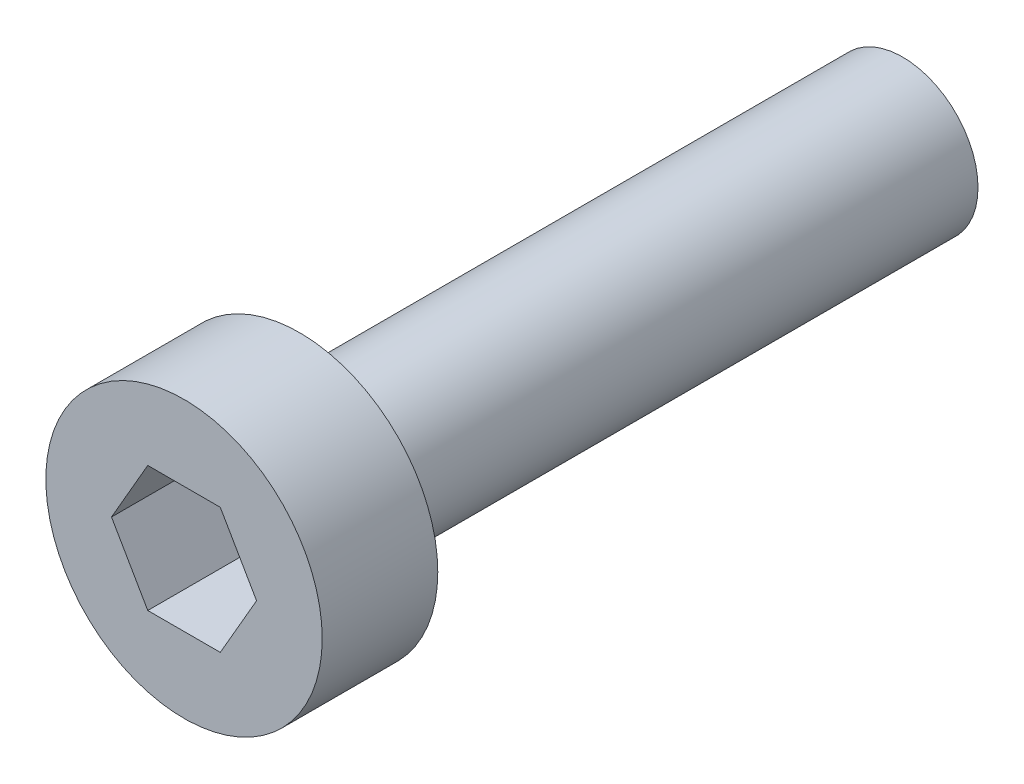
ISO-10303-21;
HEADER;
FILE_DESCRIPTION(('STEP AP214'),'2;1');
FILE_NAME('part.step','',(''),(''),'','','');
FILE_SCHEMA(('AUTOMOTIVE_DESIGN { 1 0 10303 214 1 1 1 1 }'));
ENDSEC;
DATA;
#1=APPLICATION_CONTEXT('core data for automotive mechanical design processes');
#2=APPLICATION_PROTOCOL_DEFINITION('international standard','automotive_design',2000,#1);
#3=PRODUCT_CONTEXT('',#1,'mechanical');
#4=PRODUCT('Part','Part','',(#3));
#5=PRODUCT_RELATED_PRODUCT_CATEGORY('part','',(#4));
#6=PRODUCT_DEFINITION_FORMATION('','',#4);
#7=PRODUCT_DEFINITION_CONTEXT('part definition',#1,'design');
#8=PRODUCT_DEFINITION('design','',#6,#7);
#9=PRODUCT_DEFINITION_SHAPE('','',#8);
#10=(LENGTH_UNIT() NAMED_UNIT(*) SI_UNIT(.MILLI.,.METRE.));
#11=(NAMED_UNIT(*) PLANE_ANGLE_UNIT() SI_UNIT($,.RADIAN.));
#12=(NAMED_UNIT(*) SI_UNIT($,.STERADIAN.) SOLID_ANGLE_UNIT());
#13=UNCERTAINTY_MEASURE_WITH_UNIT(LENGTH_MEASURE(1.E-05),#10,'distance_accuracy_value','');
#14=(GEOMETRIC_REPRESENTATION_CONTEXT(3) GLOBAL_UNCERTAINTY_ASSIGNED_CONTEXT((#13)) GLOBAL_UNIT_ASSIGNED_CONTEXT((#10,
#11,#12)) REPRESENTATION_CONTEXT('',''));
#15=CARTESIAN_POINT('',(0.,0.,0.));
#16=DIRECTION('',(0.,0.,1.));
#17=DIRECTION('',(1.,0.,0.));
#18=AXIS2_PLACEMENT_3D('',#15,#16,#17);
#19=CARTESIAN_POINT('',(0.,0.,12.));
#20=DIRECTION('',(0.,0.,-1.));
#21=DIRECTION('',(-1.,0.,0.));
#22=AXIS2_PLACEMENT_3D('',#19,#20,#21);
#23=CYLINDRICAL_SURFACE('',#22,1.5);
#24=CARTESIAN_POINT('',(0.,0.,12.));
#25=DIRECTION('',(0.,0.,1.));
#26=DIRECTION('',(1.,0.,0.));
#27=AXIS2_PLACEMENT_3D('',#24,#25,#26);
#28=CIRCLE('',#27,1.5);
#29=CARTESIAN_POINT('',(1.5,0.,12.));
#30=VERTEX_POINT('',#29);
#31=EDGE_CURVE('E11',#30,#30,#28,.T.);
#32=ORIENTED_EDGE('',*,*,#31,.F.);
#33=EDGE_LOOP('',(#32));
#34=FACE_BOUND('',#33,.T.);
#35=CARTESIAN_POINT('',(0.,0.,0.));
#36=DIRECTION('',(0.,0.,1.));
#37=DIRECTION('',(1.,0.,0.));
#38=AXIS2_PLACEMENT_3D('',#35,#36,#37);
#39=CIRCLE('',#38,1.5);
#40=CARTESIAN_POINT('',(1.5,0.,0.));
#41=VERTEX_POINT('',#40);
#42=EDGE_CURVE('E37',#41,#41,#39,.T.);
#43=ORIENTED_EDGE('',*,*,#42,.T.);
#44=EDGE_LOOP('',(#43));
#45=FACE_BOUND('',#44,.T.);
#46=ADVANCED_FACE('F34',(#34,#45),#23,.T.);
#47=CARTESIAN_POINT('',(0.,0.,0.));
#48=DIRECTION('',(0.,0.,1.));
#49=DIRECTION('',(1.,0.,0.));
#50=AXIS2_PLACEMENT_3D('',#47,#48,#49);
#51=PLANE('',#50);
#52=ORIENTED_EDGE('',*,*,#42,.F.);
#53=EDGE_LOOP('',(#52));
#54=FACE_BOUND('',#53,.T.);
#55=ADVANCED_FACE('F165',(#54),#51,.F.);
#56=CARTESIAN_POINT('',(0.,0.,14.3));
#57=DIRECTION('',(0.,0.,-1.));
#58=DIRECTION('',(-1.,0.,0.));
#59=AXIS2_PLACEMENT_3D('',#56,#57,#58);
#60=CYLINDRICAL_SURFACE('',#59,2.75);
#61=CARTESIAN_POINT('',(0.,0.,14.3));
#62=DIRECTION('',(0.,0.,1.));
#63=DIRECTION('',(1.,0.,0.));
#64=AXIS2_PLACEMENT_3D('',#61,#62,#63);
#65=CIRCLE('',#64,2.75);
#66=CARTESIAN_POINT('',(2.75,0.,14.3));
#67=VERTEX_POINT('',#66);
#68=EDGE_CURVE('E141',#67,#67,#65,.T.);
#69=ORIENTED_EDGE('',*,*,#68,.F.);
#70=EDGE_LOOP('',(#69));
#71=FACE_BOUND('',#70,.T.);
#72=CARTESIAN_POINT('',(0.,0.,12.));
#73=DIRECTION('',(0.,0.,1.));
#74=DIRECTION('',(1.,0.,0.));
#75=AXIS2_PLACEMENT_3D('',#72,#73,#74);
#76=CIRCLE('',#75,2.75);
#77=CARTESIAN_POINT('',(2.75,0.,12.));
#78=VERTEX_POINT('',#77);
#79=EDGE_CURVE('E135',#78,#78,#76,.T.);
#80=ORIENTED_EDGE('',*,*,#79,.T.);
#81=EDGE_LOOP('',(#80));
#82=FACE_BOUND('',#81,.T.);
#83=ADVANCED_FACE('F147',(#71,#82),#60,.T.);
#84=CARTESIAN_POINT('',(0.,0.,14.3));
#85=DIRECTION('',(0.,0.,1.));
#86=DIRECTION('',(1.,0.,0.));
#87=AXIS2_PLACEMENT_3D('',#84,#85,#86);
#88=PLANE('',#87);
#89=DIRECTION('',(0.5,0.866025403784439,0.));
#90=VECTOR('',#89,1.);
#91=CARTESIAN_POINT('',(0.721687836487032,-1.25,14.3));
#92=LINE('',#91,#90);
#93=CARTESIAN_POINT('',(0.721687836487032,-1.25,14.3));
#94=VERTEX_POINT('',#93);
#95=CARTESIAN_POINT('',(1.44337567297406,0.,14.3));
#96=VERTEX_POINT('',#95);
#97=EDGE_CURVE('E48',#94,#96,#92,.T.);
#98=ORIENTED_EDGE('',*,*,#97,.F.);
#99=DIRECTION('',(1.,0.,0.));
#100=VECTOR('',#99,1.);
#101=CARTESIAN_POINT('',(-0.721687836487033,-1.25,14.3));
#102=LINE('',#101,#100);
#103=CARTESIAN_POINT('',(-0.721687836487033,-1.25,14.3));
#104=VERTEX_POINT('',#103);
#105=EDGE_CURVE('E131',#104,#94,#102,.T.);
#106=ORIENTED_EDGE('',*,*,#105,.F.);
#107=DIRECTION('',(0.5,-0.866025403784439,0.));
#108=VECTOR('',#107,1.);
#109=CARTESIAN_POINT('',(-1.44337567297407,0.,14.3));
#110=LINE('',#109,#108);
#111=CARTESIAN_POINT('',(-1.44337567297407,0.,14.3));
#112=VERTEX_POINT('',#111);
#113=EDGE_CURVE('E129',#112,#104,#110,.T.);
#114=ORIENTED_EDGE('',*,*,#113,.F.);
#115=DIRECTION('',(-0.5,-0.866025403784439,0.));
#116=VECTOR('',#115,1.);
#117=CARTESIAN_POINT('',(-0.721687836487033,1.25,14.3));
#118=LINE('',#117,#116);
#119=CARTESIAN_POINT('',(-0.721687836487033,1.25,14.3));
#120=VERTEX_POINT('',#119);
#121=EDGE_CURVE('E96',#120,#112,#118,.T.);
#122=ORIENTED_EDGE('',*,*,#121,.F.);
#123=DIRECTION('',(-1.,0.,0.));
#124=VECTOR('',#123,1.);
#125=CARTESIAN_POINT('',(0.721687836487032,1.25,14.3));
#126=LINE('',#125,#124);
#127=CARTESIAN_POINT('',(0.721687836487032,1.25,14.3));
#128=VERTEX_POINT('',#127);
#129=EDGE_CURVE('E125',#128,#120,#126,.T.);
#130=ORIENTED_EDGE('',*,*,#129,.F.);
#131=DIRECTION('',(-0.5,0.866025403784439,0.));
#132=VECTOR('',#131,1.);
#133=CARTESIAN_POINT('',(1.44337567297406,0.,14.3));
#134=LINE('',#133,#132);
#135=EDGE_CURVE('E122',#96,#128,#134,.T.);
#136=ORIENTED_EDGE('',*,*,#135,.F.);
#137=EDGE_LOOP('',(#98,#106,#114,#122,#130,#136));
#138=FACE_BOUND('',#137,.T.);
#139=ORIENTED_EDGE('',*,*,#68,.T.);
#140=EDGE_LOOP('',(#139));
#141=FACE_BOUND('',#140,.T.);
#142=ADVANCED_FACE('F152',(#138,#141),#88,.T.);
#143=CARTESIAN_POINT('',(0.,0.,12.));
#144=DIRECTION('',(0.,0.,1.));
#145=DIRECTION('',(1.,0.,0.));
#146=AXIS2_PLACEMENT_3D('',#143,#144,#145);
#147=PLANE('',#146);
#148=ORIENTED_EDGE('',*,*,#31,.T.);
#149=EDGE_LOOP('',(#148));
#150=FACE_BOUND('',#149,.T.);
#151=ORIENTED_EDGE('',*,*,#79,.F.);
#152=EDGE_LOOP('',(#151));
#153=FACE_BOUND('',#152,.T.);
#154=ADVANCED_FACE('F149',(#150,#153),#147,.F.);
#155=CARTESIAN_POINT('',(0.721687836487032,-1.25,12.3));
#156=DIRECTION('',(0.866025403784439,-0.5,0.));
#157=DIRECTION('',(0.5,0.866025403784439,0.));
#158=AXIS2_PLACEMENT_3D('',#155,#156,#157);
#159=PLANE('',#158);
#160=ORIENTED_EDGE('',*,*,#97,.T.);
#161=DIRECTION('',(0.,0.,1.));
#162=VECTOR('',#161,1.);
#163=CARTESIAN_POINT('',(1.44337567297406,0.,12.3));
#164=LINE('',#163,#162);
#165=CARTESIAN_POINT('',(1.44337567297406,0.,12.3));
#166=VERTEX_POINT('',#165);
#167=EDGE_CURVE('E78',#166,#96,#164,.T.);
#168=ORIENTED_EDGE('',*,*,#167,.F.);
#169=DIRECTION('',(0.5,0.866025403784439,0.));
#170=VECTOR('',#169,1.);
#171=CARTESIAN_POINT('',(0.721687836487032,-1.25,12.3));
#172=LINE('',#171,#170);
#173=CARTESIAN_POINT('',(0.721687836487032,-1.25,12.3));
#174=VERTEX_POINT('',#173);
#175=EDGE_CURVE('E133',#174,#166,#172,.T.);
#176=ORIENTED_EDGE('',*,*,#175,.F.);
#177=DIRECTION('',(0.,0.,1.));
#178=VECTOR('',#177,1.);
#179=CARTESIAN_POINT('',(0.721687836487032,-1.25,12.3));
#180=LINE('',#179,#178);
#181=EDGE_CURVE('E56',#174,#94,#180,.T.);
#182=ORIENTED_EDGE('',*,*,#181,.T.);
#183=EDGE_LOOP('',(#160,#168,#176,#182));
#184=FACE_BOUND('',#183,.T.);
#185=ADVANCED_FACE('F151',(#184),#159,.F.);
#186=CARTESIAN_POINT('',(-0.721687836487033,-1.25,12.3));
#187=DIRECTION('',(0.,-1.,0.));
#188=DIRECTION('',(1.,0.,0.));
#189=AXIS2_PLACEMENT_3D('',#186,#187,#188);
#190=PLANE('',#189);
#191=ORIENTED_EDGE('',*,*,#105,.T.);
#192=ORIENTED_EDGE('',*,*,#181,.F.);
#193=DIRECTION('',(1.,0.,0.));
#194=VECTOR('',#193,1.);
#195=CARTESIAN_POINT('',(-0.721687836487033,-1.25,12.3));
#196=LINE('',#195,#194);
#197=CARTESIAN_POINT('',(-0.721687836487033,-1.25,12.3));
#198=VERTEX_POINT('',#197);
#199=EDGE_CURVE('E108',#198,#174,#196,.T.);
#200=ORIENTED_EDGE('',*,*,#199,.F.);
#201=DIRECTION('',(0.,0.,1.));
#202=VECTOR('',#201,1.);
#203=CARTESIAN_POINT('',(-0.721687836487033,-1.25,12.3));
#204=LINE('',#203,#202);
#205=EDGE_CURVE('E100',#198,#104,#204,.T.);
#206=ORIENTED_EDGE('',*,*,#205,.T.);
#207=EDGE_LOOP('',(#191,#192,#200,#206));
#208=FACE_BOUND('',#207,.T.);
#209=ADVANCED_FACE('F159',(#208),#190,.F.);
#210=CARTESIAN_POINT('',(-1.44337567297407,0.,12.3));
#211=DIRECTION('',(-0.866025403784439,-0.5,0.));
#212=DIRECTION('',(0.5,-0.866025403784439,0.));
#213=AXIS2_PLACEMENT_3D('',#210,#211,#212);
#214=PLANE('',#213);
#215=ORIENTED_EDGE('',*,*,#113,.T.);
#216=ORIENTED_EDGE('',*,*,#205,.F.);
#217=DIRECTION('',(0.5,-0.866025403784439,0.));
#218=VECTOR('',#217,1.);
#219=CARTESIAN_POINT('',(-1.44337567297407,0.,12.3));
#220=LINE('',#219,#218);
#221=CARTESIAN_POINT('',(-1.44337567297407,0.,12.3));
#222=VERTEX_POINT('',#221);
#223=EDGE_CURVE('E104',#222,#198,#220,.T.);
#224=ORIENTED_EDGE('',*,*,#223,.F.);
#225=DIRECTION('',(0.,0.,1.));
#226=VECTOR('',#225,1.);
#227=CARTESIAN_POINT('',(-1.44337567297407,0.,12.3));
#228=LINE('',#227,#226);
#229=EDGE_CURVE('E89',#222,#112,#228,.T.);
#230=ORIENTED_EDGE('',*,*,#229,.T.);
#231=EDGE_LOOP('',(#215,#216,#224,#230));
#232=FACE_BOUND('',#231,.T.);
#233=ADVANCED_FACE('F105',(#232),#214,.F.);
#234=CARTESIAN_POINT('',(-0.721687836487033,1.25,12.3));
#235=DIRECTION('',(-0.866025403784439,0.5,0.));
#236=DIRECTION('',(-0.5,-0.866025403784439,0.));
#237=AXIS2_PLACEMENT_3D('',#234,#235,#236);
#238=PLANE('',#237);
#239=ORIENTED_EDGE('',*,*,#121,.T.);
#240=ORIENTED_EDGE('',*,*,#229,.F.);
#241=DIRECTION('',(-0.5,-0.866025403784439,0.));
#242=VECTOR('',#241,1.);
#243=CARTESIAN_POINT('',(-0.721687836487033,1.25,12.3));
#244=LINE('',#243,#242);
#245=CARTESIAN_POINT('',(-0.721687836487033,1.25,12.3));
#246=VERTEX_POINT('',#245);
#247=EDGE_CURVE('E93',#246,#222,#244,.T.);
#248=ORIENTED_EDGE('',*,*,#247,.F.);
#249=DIRECTION('',(0.,0.,1.));
#250=VECTOR('',#249,1.);
#251=CARTESIAN_POINT('',(-0.721687836487033,1.25,12.3));
#252=LINE('',#251,#250);
#253=EDGE_CURVE('E101',#246,#120,#252,.T.);
#254=ORIENTED_EDGE('',*,*,#253,.T.);
#255=EDGE_LOOP('',(#239,#240,#248,#254));
#256=FACE_BOUND('',#255,.T.);
#257=ADVANCED_FACE('F91',(#256),#238,.F.);
#258=CARTESIAN_POINT('',(0.721687836487032,1.25,12.3));
#259=DIRECTION('',(0.,1.,0.));
#260=DIRECTION('',(0.,0.,1.));
#261=AXIS2_PLACEMENT_3D('',#258,#259,#260);
#262=PLANE('',#261);
#263=ORIENTED_EDGE('',*,*,#129,.T.);
#264=ORIENTED_EDGE('',*,*,#253,.F.);
#265=DIRECTION('',(-1.,0.,0.));
#266=VECTOR('',#265,1.);
#267=CARTESIAN_POINT('',(0.721687836487032,1.25,12.3));
#268=LINE('',#267,#266);
#269=CARTESIAN_POINT('',(0.721687836487032,1.25,12.3));
#270=VERTEX_POINT('',#269);
#271=EDGE_CURVE('E114',#270,#246,#268,.T.);
#272=ORIENTED_EDGE('',*,*,#271,.F.);
#273=DIRECTION('',(0.,0.,1.));
#274=VECTOR('',#273,1.);
#275=CARTESIAN_POINT('',(0.721687836487032,1.25,12.3));
#276=LINE('',#275,#274);
#277=EDGE_CURVE('E138',#270,#128,#276,.T.);
#278=ORIENTED_EDGE('',*,*,#277,.T.);
#279=EDGE_LOOP('',(#263,#264,#272,#278));
#280=FACE_BOUND('',#279,.T.);
#281=ADVANCED_FACE('F220',(#280),#262,.F.);
#282=CARTESIAN_POINT('',(1.44337567297406,0.,12.3));
#283=DIRECTION('',(0.866025403784439,0.5,0.));
#284=DIRECTION('',(-0.5,0.866025403784439,0.));
#285=AXIS2_PLACEMENT_3D('',#282,#283,#284);
#286=PLANE('',#285);
#287=ORIENTED_EDGE('',*,*,#135,.T.);
#288=ORIENTED_EDGE('',*,*,#277,.F.);
#289=DIRECTION('',(-0.5,0.866025403784439,0.));
#290=VECTOR('',#289,1.);
#291=CARTESIAN_POINT('',(1.44337567297406,0.,12.3));
#292=LINE('',#291,#290);
#293=EDGE_CURVE('E116',#166,#270,#292,.T.);
#294=ORIENTED_EDGE('',*,*,#293,.F.);
#295=ORIENTED_EDGE('',*,*,#167,.T.);
#296=EDGE_LOOP('',(#287,#288,#294,#295));
#297=FACE_BOUND('',#296,.T.);
#298=ADVANCED_FACE('F229',(#297),#286,.F.);
#299=CARTESIAN_POINT('',(0.,0.,12.3));
#300=DIRECTION('',(0.,0.,1.));
#301=DIRECTION('',(1.,0.,0.));
#302=AXIS2_PLACEMENT_3D('',#299,#300,#301);
#303=PLANE('',#302);
#304=ORIENTED_EDGE('',*,*,#175,.T.);
#305=ORIENTED_EDGE('',*,*,#293,.T.);
#306=ORIENTED_EDGE('',*,*,#271,.T.);
#307=ORIENTED_EDGE('',*,*,#247,.T.);
#308=ORIENTED_EDGE('',*,*,#223,.T.);
#309=ORIENTED_EDGE('',*,*,#199,.T.);
#310=EDGE_LOOP('',(#304,#305,#306,#307,#308,#309));
#311=FACE_BOUND('',#310,.T.);
#312=ADVANCED_FACE('F111',(#311),#303,.T.);
#313=CLOSED_SHELL('',(#46,#55,#83,#142,#154,#185,#209,#233,#257,#281,#298,#312));
#314=MANIFOLD_SOLID_BREP('B2',#313);
#315=ADVANCED_BREP_SHAPE_REPRESENTATION('',(#18,#314),#14);
#316=SHAPE_DEFINITION_REPRESENTATION(#9,#315);
ENDSEC;
END-ISO-10303-21;
